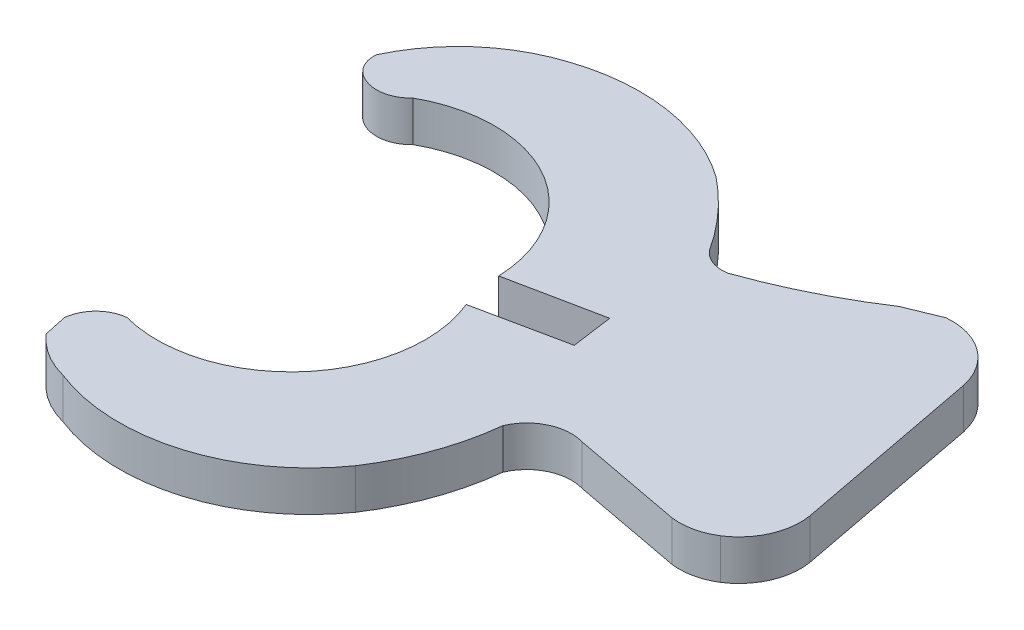
ISO-10303-21;
HEADER;
FILE_DESCRIPTION(('STEP AP214'),'2;1');
FILE_NAME('part.step','',(''),(''),'','','');
FILE_SCHEMA(('AUTOMOTIVE_DESIGN { 1 0 10303 214 1 1 1 1 }'));
ENDSEC;
DATA;
#1=APPLICATION_CONTEXT('core data for automotive mechanical design processes');
#2=APPLICATION_PROTOCOL_DEFINITION('international standard','automotive_design',2000,#1);
#3=PRODUCT_CONTEXT('',#1,'mechanical');
#4=PRODUCT('Part','Part','',(#3));
#5=PRODUCT_RELATED_PRODUCT_CATEGORY('part','',(#4));
#6=PRODUCT_DEFINITION_FORMATION('','',#4);
#7=PRODUCT_DEFINITION_CONTEXT('part definition',#1,'design');
#8=PRODUCT_DEFINITION('design','',#6,#7);
#9=PRODUCT_DEFINITION_SHAPE('','',#8);
#10=(LENGTH_UNIT() NAMED_UNIT(*) SI_UNIT(.MILLI.,.METRE.));
#11=(NAMED_UNIT(*) PLANE_ANGLE_UNIT() SI_UNIT($,.RADIAN.));
#12=(NAMED_UNIT(*) SI_UNIT($,.STERADIAN.) SOLID_ANGLE_UNIT());
#13=UNCERTAINTY_MEASURE_WITH_UNIT(LENGTH_MEASURE(1.E-05),#10,'distance_accuracy_value','');
#14=(GEOMETRIC_REPRESENTATION_CONTEXT(3) GLOBAL_UNCERTAINTY_ASSIGNED_CONTEXT((#13)) GLOBAL_UNIT_ASSIGNED_CONTEXT((#10,
#11,#12)) REPRESENTATION_CONTEXT('',''));
#15=CARTESIAN_POINT('',(0.,0.,0.));
#16=DIRECTION('',(0.,0.,1.));
#17=DIRECTION('',(1.,0.,0.));
#18=AXIS2_PLACEMENT_3D('',#15,#16,#17);
#19=CARTESIAN_POINT('',(-189.790209014968,3.,-54.2619894440154));
#20=DIRECTION('',(0.,-1.,0.));
#21=DIRECTION('',(0.,0.,-1.));
#22=AXIS2_PLACEMENT_3D('',#19,#20,#21);
#23=CYLINDRICAL_SURFACE('',#22,9.8473549206959);
#24=CARTESIAN_POINT('',(-189.790209014968,0.,-54.2619894440154));
#25=DIRECTION('',(0.,-1.,0.));
#26=DIRECTION('',(0.,0.,1.));
#27=AXIS2_PLACEMENT_3D('',#24,#25,#26);
#28=CIRCLE('',#27,9.8473549206959);
#29=CARTESIAN_POINT('',(-194.590600000006,0.,-62.8600500000321));
#30=VERTEX_POINT('',#29);
#31=CARTESIAN_POINT('',(-179.9485,0.,-54.5954));
#32=VERTEX_POINT('',#31);
#33=EDGE_CURVE('E227',#30,#32,#28,.T.);
#34=ORIENTED_EDGE('',*,*,#33,.T.);
#35=DIRECTION('',(0.,-1.,0.));
#36=VECTOR('',#35,1.);
#37=CARTESIAN_POINT('',(-179.9485,3.,-54.5954));
#38=LINE('',#37,#36);
#39=CARTESIAN_POINT('',(-179.9485,3.,-54.5954));
#40=VERTEX_POINT('',#39);
#41=EDGE_CURVE('E11',#40,#32,#38,.T.);
#42=ORIENTED_EDGE('',*,*,#41,.F.);
#43=CARTESIAN_POINT('',(-189.790209014968,3.,-54.2619894440154));
#44=DIRECTION('',(0.,-1.,0.));
#45=DIRECTION('',(0.,0.,1.));
#46=AXIS2_PLACEMENT_3D('',#43,#44,#45);
#47=CIRCLE('',#46,9.8473549206959);
#48=CARTESIAN_POINT('',(-194.590600000006,3.,-62.8600500000321));
#49=VERTEX_POINT('',#48);
#50=EDGE_CURVE('E273',#49,#40,#47,.T.);
#51=ORIENTED_EDGE('',*,*,#50,.F.);
#52=DIRECTION('',(0.,-1.,0.));
#53=VECTOR('',#52,1.);
#54=CARTESIAN_POINT('',(-194.590600000006,3.,-62.8600500000321));
#55=LINE('',#54,#53);
#56=EDGE_CURVE('E223',#49,#30,#55,.T.);
#57=ORIENTED_EDGE('',*,*,#56,.T.);
#58=EDGE_LOOP('',(#34,#42,#51,#57));
#59=FACE_BOUND('',#58,.T.);
#60=ADVANCED_FACE('F35',(#59),#23,.F.);
#61=CARTESIAN_POINT('',(-179.9485,3.,-54.5954));
#62=DIRECTION('',(-0.199884569018164,0.,-0.979819452281094));
#63=DIRECTION('',(-0.979819452281094,0.,0.199884569018164));
#64=AXIS2_PLACEMENT_3D('',#61,#62,#63);
#65=PLANE('',#64);
#66=DIRECTION('',(0.979819452281094,0.,-0.199884569018164));
#67=VECTOR('',#66,1.);
#68=CARTESIAN_POINT('',(-179.9485,0.,-54.5954));
#69=LINE('',#68,#67);
#70=CARTESIAN_POINT('',(-173.09345,0.,-55.99384));
#71=VERTEX_POINT('',#70);
#72=EDGE_CURVE('E230',#32,#71,#69,.T.);
#73=ORIENTED_EDGE('',*,*,#72,.T.);
#74=DIRECTION('',(0.,-1.,0.));
#75=VECTOR('',#74,1.);
#76=CARTESIAN_POINT('',(-173.09345,3.,-55.99384));
#77=LINE('',#76,#75);
#78=CARTESIAN_POINT('',(-173.09345,3.,-55.99384));
#79=VERTEX_POINT('',#78);
#80=EDGE_CURVE('E43',#79,#71,#77,.T.);
#81=ORIENTED_EDGE('',*,*,#80,.F.);
#82=DIRECTION('',(0.979819452281094,0.,-0.199884569018164));
#83=VECTOR('',#82,1.);
#84=CARTESIAN_POINT('',(-179.9485,3.,-54.5954));
#85=LINE('',#84,#83);
#86=EDGE_CURVE('E142',#40,#79,#85,.T.);
#87=ORIENTED_EDGE('',*,*,#86,.F.);
#88=ORIENTED_EDGE('',*,*,#41,.T.);
#89=EDGE_LOOP('',(#73,#81,#87,#88));
#90=FACE_BOUND('',#89,.T.);
#91=ADVANCED_FACE('F411',(#90),#65,.F.);
#92=CARTESIAN_POINT('',(-173.09345,3.,-55.99384));
#93=DIRECTION('',(0.990626040398804,0.,-0.136601786532197));
#94=DIRECTION('',(-0.136601786532197,0.,-0.990626040398804));
#95=AXIS2_PLACEMENT_3D('',#92,#93,#94);
#96=PLANE('',#95);
#97=DIRECTION('',(0.136601786532197,0.,0.990626040398804));
#98=VECTOR('',#97,1.);
#99=CARTESIAN_POINT('',(-173.09345,0.,-55.99384));
#100=LINE('',#99,#98);
#101=CARTESIAN_POINT('',(-172.67158,0.,-52.93447));
#102=VERTEX_POINT('',#101);
#103=EDGE_CURVE('E232',#71,#102,#100,.T.);
#104=ORIENTED_EDGE('',*,*,#103,.T.);
#105=DIRECTION('',(0.,-1.,0.));
#106=VECTOR('',#105,1.);
#107=CARTESIAN_POINT('',(-172.67158,3.,-52.93447));
#108=LINE('',#107,#106);
#109=CARTESIAN_POINT('',(-172.67158,3.,-52.93447));
#110=VERTEX_POINT('',#109);
#111=EDGE_CURVE('E328',#110,#102,#108,.T.);
#112=ORIENTED_EDGE('',*,*,#111,.F.);
#113=DIRECTION('',(0.136601786532197,0.,0.990626040398804));
#114=VECTOR('',#113,1.);
#115=CARTESIAN_POINT('',(-173.09345,3.,-55.99384));
#116=LINE('',#115,#114);
#117=EDGE_CURVE('E336',#79,#110,#116,.T.);
#118=ORIENTED_EDGE('',*,*,#117,.F.);
#119=ORIENTED_EDGE('',*,*,#80,.T.);
#120=EDGE_LOOP('',(#104,#112,#118,#119));
#121=FACE_BOUND('',#120,.T.);
#122=ADVANCED_FACE('F334',(#121),#96,.F.);
#123=CARTESIAN_POINT('',(-172.67158,3.,-52.93447));
#124=DIRECTION('',(0.204367247084627,0.,0.97889428863338));
#125=DIRECTION('',(0.97889428863338,0.,-0.204367247084627));
#126=AXIS2_PLACEMENT_3D('',#123,#124,#125);
#127=PLANE('',#126);
#128=DIRECTION('',(-0.97889428863338,0.,0.204367247084627));
#129=VECTOR('',#128,1.);
#130=CARTESIAN_POINT('',(-172.67158,0.,-52.93447));
#131=LINE('',#130,#129);
#132=CARTESIAN_POINT('',(-179.315859999997,0.,-51.5473200000194));
#133=VERTEX_POINT('',#132);
#134=EDGE_CURVE('E234',#102,#133,#131,.T.);
#135=ORIENTED_EDGE('',*,*,#134,.T.);
#136=DIRECTION('',(0.,-1.,0.));
#137=VECTOR('',#136,1.);
#138=CARTESIAN_POINT('',(-179.315859999997,3.,-51.5473200000194));
#139=LINE('',#138,#137);
#140=CARTESIAN_POINT('',(-179.315859999997,3.,-51.5473200000194));
#141=VERTEX_POINT('',#140);
#142=EDGE_CURVE('E325',#141,#133,#139,.T.);
#143=ORIENTED_EDGE('',*,*,#142,.F.);
#144=DIRECTION('',(-0.97889428863338,0.,0.204367247084627));
#145=VECTOR('',#144,1.);
#146=CARTESIAN_POINT('',(-172.67158,3.,-52.93447));
#147=LINE('',#146,#145);
#148=EDGE_CURVE('E354',#110,#141,#147,.T.);
#149=ORIENTED_EDGE('',*,*,#148,.F.);
#150=ORIENTED_EDGE('',*,*,#111,.T.);
#151=EDGE_LOOP('',(#135,#143,#149,#150));
#152=FACE_BOUND('',#151,.T.);
#153=ADVANCED_FACE('F345',(#152),#127,.F.);
#154=CARTESIAN_POINT('',(-188.5452592183,3.,-47.7496608923));
#155=DIRECTION('',(0.,-1.,0.));
#156=DIRECTION('',(0.,0.,-1.));
#157=AXIS2_PLACEMENT_3D('',#154,#155,#156);
#158=CYLINDRICAL_SURFACE('',#157,9.980181593);
#159=CARTESIAN_POINT('',(-188.5452592183,0.,-47.7496608923));
#160=DIRECTION('',(0.,-1.,0.));
#161=DIRECTION('',(0.,0.,1.));
#162=AXIS2_PLACEMENT_3D('',#159,#160,#161);
#163=CIRCLE('',#162,9.980181593);
#164=CARTESIAN_POINT('',(-191.096100000033,0.,-38.1009699999819));
#165=VERTEX_POINT('',#164);
#166=EDGE_CURVE('E236',#133,#165,#163,.T.);
#167=ORIENTED_EDGE('',*,*,#166,.T.);
#168=DIRECTION('',(0.,-1.,0.));
#169=VECTOR('',#168,1.);
#170=CARTESIAN_POINT('',(-191.096100000033,3.,-38.1009699999819));
#171=LINE('',#170,#169);
#172=CARTESIAN_POINT('',(-191.096100000033,3.,-38.1009699999819));
#173=VERTEX_POINT('',#172);
#174=EDGE_CURVE('E322',#173,#165,#171,.T.);
#175=ORIENTED_EDGE('',*,*,#174,.F.);
#176=CARTESIAN_POINT('',(-188.5452592183,3.,-47.7496608923));
#177=DIRECTION('',(0.,-1.,0.));
#178=DIRECTION('',(0.,0.,1.));
#179=AXIS2_PLACEMENT_3D('',#176,#177,#178);
#180=CIRCLE('',#179,9.980181593);
#181=EDGE_CURVE('E351',#141,#173,#180,.T.);
#182=ORIENTED_EDGE('',*,*,#181,.F.);
#183=ORIENTED_EDGE('',*,*,#142,.T.);
#184=EDGE_LOOP('',(#167,#175,#182,#183));
#185=FACE_BOUND('',#184,.T.);
#186=ADVANCED_FACE('F349',(#185),#158,.F.);
#187=CARTESIAN_POINT('',(-190.807242270197,3.,-35.501727707026));
#188=DIRECTION('',(0.,-1.,0.));
#189=DIRECTION('',(0.,0.,-1.));
#190=AXIS2_PLACEMENT_3D('',#187,#188,#189);
#191=CYLINDRICAL_SURFACE('',#190,2.6152436379);
#192=CARTESIAN_POINT('',(-190.807242270197,0.,-35.501727707026));
#193=DIRECTION('',(0.,1.,0.));
#194=DIRECTION('',(0.,0.,1.));
#195=AXIS2_PLACEMENT_3D('',#192,#193,#194);
#196=CIRCLE('',#195,2.6152436379);
#197=CARTESIAN_POINT('',(-193.409239999947,0.,-35.7646099999899));
#198=VERTEX_POINT('',#197);
#199=EDGE_CURVE('E238',#165,#198,#196,.T.);
#200=ORIENTED_EDGE('',*,*,#199,.T.);
#201=DIRECTION('',(0.,-1.,0.));
#202=VECTOR('',#201,1.);
#203=CARTESIAN_POINT('',(-193.409239999947,3.,-35.7646099999899));
#204=LINE('',#203,#202);
#205=CARTESIAN_POINT('',(-193.409239999947,3.,-35.7646099999899));
#206=VERTEX_POINT('',#205);
#207=EDGE_CURVE('E319',#206,#198,#204,.T.);
#208=ORIENTED_EDGE('',*,*,#207,.F.);
#209=CARTESIAN_POINT('',(-190.807242270197,3.,-35.501727707026));
#210=DIRECTION('',(0.,1.,0.));
#211=DIRECTION('',(0.,0.,1.));
#212=AXIS2_PLACEMENT_3D('',#209,#210,#211);
#213=CIRCLE('',#212,2.6152436379);
#214=EDGE_CURVE('E353',#173,#206,#213,.T.);
#215=ORIENTED_EDGE('',*,*,#214,.F.);
#216=ORIENTED_EDGE('',*,*,#174,.T.);
#217=EDGE_LOOP('',(#200,#208,#215,#216));
#218=FACE_BOUND('',#217,.T.);
#219=ADVANCED_FACE('F424',(#218),#191,.T.);
#220=CARTESIAN_POINT('',(-193.409239999947,3.,-35.7646099999899));
#221=DIRECTION('',(0.977702522578803,0.,-0.209994707892948));
#222=DIRECTION('',(-0.209994707892948,0.,-0.977702522578803));
#223=AXIS2_PLACEMENT_3D('',#220,#221,#222);
#224=PLANE('',#223);
#225=DIRECTION('',(0.209994707892948,0.,0.977702522578803));
#226=VECTOR('',#225,1.);
#227=CARTESIAN_POINT('',(-193.409239999947,0.,-35.7646099999899));
#228=LINE('',#227,#226);
#229=CARTESIAN_POINT('',(-193.04089,0.,-34.04963));
#230=VERTEX_POINT('',#229);
#231=EDGE_CURVE('E240',#198,#230,#228,.T.);
#232=ORIENTED_EDGE('',*,*,#231,.T.);
#233=DIRECTION('',(0.,-1.,0.));
#234=VECTOR('',#233,1.);
#235=CARTESIAN_POINT('',(-193.04089,3.,-34.04963));
#236=LINE('',#235,#234);
#237=CARTESIAN_POINT('',(-193.04089,3.,-34.04963));
#238=VERTEX_POINT('',#237);
#239=EDGE_CURVE('E316',#238,#230,#236,.T.);
#240=ORIENTED_EDGE('',*,*,#239,.F.);
#241=DIRECTION('',(0.209994707892948,0.,0.977702522578803));
#242=VECTOR('',#241,1.);
#243=CARTESIAN_POINT('',(-193.409239999947,3.,-35.7646099999899));
#244=LINE('',#243,#242);
#245=EDGE_CURVE('E356',#206,#238,#244,.T.);
#246=ORIENTED_EDGE('',*,*,#245,.F.);
#247=ORIENTED_EDGE('',*,*,#207,.T.);
#248=EDGE_LOOP('',(#232,#240,#246,#247));
#249=FACE_BOUND('',#248,.T.);
#250=ADVANCED_FACE('F427',(#249),#224,.F.);
#251=CARTESIAN_POINT('',(-188.179972638056,3.,-38.2084554085401));
#252=DIRECTION('',(0.,-1.,0.));
#253=DIRECTION('',(0.,0.,-1.));
#254=AXIS2_PLACEMENT_3D('',#251,#252,#253);
#255=CYLINDRICAL_SURFACE('',#254,6.3972139544);
#256=CARTESIAN_POINT('',(-188.179972638056,0.,-38.2084554085401));
#257=DIRECTION('',(0.,1.,0.));
#258=DIRECTION('',(0.,0.,1.));
#259=AXIS2_PLACEMENT_3D('',#256,#257,#258);
#260=CIRCLE('',#259,6.3972139544);
#261=CARTESIAN_POINT('',(-189.776369999954,0.,-32.0136300000808));
#262=VERTEX_POINT('',#261);
#263=EDGE_CURVE('E242',#230,#262,#260,.T.);
#264=ORIENTED_EDGE('',*,*,#263,.T.);
#265=DIRECTION('',(0.,-1.,0.));
#266=VECTOR('',#265,1.);
#267=CARTESIAN_POINT('',(-189.776369999954,3.,-32.0136300000808));
#268=LINE('',#267,#266);
#269=CARTESIAN_POINT('',(-189.776369999954,3.,-32.0136300000808));
#270=VERTEX_POINT('',#269);
#271=EDGE_CURVE('E313',#270,#262,#268,.T.);
#272=ORIENTED_EDGE('',*,*,#271,.F.);
#273=CARTESIAN_POINT('',(-188.179972638056,3.,-38.2084554085401));
#274=DIRECTION('',(0.,1.,0.));
#275=DIRECTION('',(0.,0.,1.));
#276=AXIS2_PLACEMENT_3D('',#273,#274,#275);
#277=CIRCLE('',#276,6.3972139544);
#278=EDGE_CURVE('E362',#238,#270,#277,.T.);
#279=ORIENTED_EDGE('',*,*,#278,.F.);
#280=ORIENTED_EDGE('',*,*,#239,.T.);
#281=EDGE_LOOP('',(#264,#272,#279,#280));
#282=FACE_BOUND('',#281,.T.);
#283=ADVANCED_FACE('F431',(#282),#255,.T.);
#284=CARTESIAN_POINT('',(-184.627202129404,3.,-45.2015593580367));
#285=DIRECTION('',(0.,-1.,0.));
#286=DIRECTION('',(0.,0.,-1.));
#287=AXIS2_PLACEMENT_3D('',#284,#285,#286);
#288=CYLINDRICAL_SURFACE('',#287,14.1575213406);
#289=CARTESIAN_POINT('',(-184.627202129404,0.,-45.2015593580367));
#290=DIRECTION('',(0.,1.,0.));
#291=DIRECTION('',(0.,0.,1.));
#292=AXIS2_PLACEMENT_3D('',#289,#290,#291);
#293=CIRCLE('',#292,14.1575213406);
#294=CARTESIAN_POINT('',(-173.046290000033,0.,-37.057979999957));
#295=VERTEX_POINT('',#294);
#296=EDGE_CURVE('E244',#262,#295,#293,.T.);
#297=ORIENTED_EDGE('',*,*,#296,.T.);
#298=DIRECTION('',(0.,-1.,0.));
#299=VECTOR('',#298,1.);
#300=CARTESIAN_POINT('',(-173.046290000033,3.,-37.057979999957));
#301=LINE('',#300,#299);
#302=CARTESIAN_POINT('',(-173.046290000033,3.,-37.057979999957));
#303=VERTEX_POINT('',#302);
#304=EDGE_CURVE('E310',#303,#295,#301,.T.);
#305=ORIENTED_EDGE('',*,*,#304,.F.);
#306=CARTESIAN_POINT('',(-184.627202129404,3.,-45.2015593580367));
#307=DIRECTION('',(0.,1.,0.));
#308=DIRECTION('',(0.,0.,1.));
#309=AXIS2_PLACEMENT_3D('',#306,#307,#308);
#310=CIRCLE('',#309,14.1575213406);
#311=EDGE_CURVE('E364',#270,#303,#310,.T.);
#312=ORIENTED_EDGE('',*,*,#311,.F.);
#313=ORIENTED_EDGE('',*,*,#271,.T.);
#314=EDGE_LOOP('',(#297,#305,#312,#313));
#315=FACE_BOUND('',#314,.T.);
#316=ADVANCED_FACE('F435',(#315),#288,.T.);
#317=CARTESIAN_POINT('',(-188.321957897398,3.,-47.0926958520139));
#318=DIRECTION('',(0.,-1.,0.));
#319=DIRECTION('',(0.,0.,-1.));
#320=AXIS2_PLACEMENT_3D('',#317,#318,#319);
#321=CYLINDRICAL_SURFACE('',#320,18.2768036577);
#322=CARTESIAN_POINT('',(-188.321957897398,0.,-47.0926958520139));
#323=DIRECTION('',(0.,1.,0.));
#324=DIRECTION('',(0.,0.,1.));
#325=AXIS2_PLACEMENT_3D('',#322,#323,#324);
#326=CIRCLE('',#325,18.2768036577);
#327=CARTESIAN_POINT('',(-170.152950000006,0.,-45.1105999999925));
#328=VERTEX_POINT('',#327);
#329=EDGE_CURVE('E246',#295,#328,#326,.T.);
#330=ORIENTED_EDGE('',*,*,#329,.T.);
#331=DIRECTION('',(0.,-1.,0.));
#332=VECTOR('',#331,1.);
#333=CARTESIAN_POINT('',(-170.152950000006,3.,-45.1105999999925));
#334=LINE('',#333,#332);
#335=CARTESIAN_POINT('',(-170.152950000006,3.,-45.1105999999925));
#336=VERTEX_POINT('',#335);
#337=EDGE_CURVE('E307',#336,#328,#334,.T.);
#338=ORIENTED_EDGE('',*,*,#337,.F.);
#339=CARTESIAN_POINT('',(-188.321957897398,3.,-47.0926958520139));
#340=DIRECTION('',(0.,1.,0.));
#341=DIRECTION('',(0.,0.,1.));
#342=AXIS2_PLACEMENT_3D('',#339,#340,#341);
#343=CIRCLE('',#342,18.2768036577);
#344=EDGE_CURVE('E366',#303,#336,#343,.T.);
#345=ORIENTED_EDGE('',*,*,#344,.F.);
#346=ORIENTED_EDGE('',*,*,#304,.T.);
#347=EDGE_LOOP('',(#330,#338,#345,#346));
#348=FACE_BOUND('',#347,.T.);
#349=ADVANCED_FACE('F439',(#348),#321,.T.);
#350=CARTESIAN_POINT('',(-167.090596226603,3.,-43.8205217894015));
#351=DIRECTION('',(0.,-1.,0.));
#352=DIRECTION('',(0.,0.,-1.));
#353=AXIS2_PLACEMENT_3D('',#350,#351,#352);
#354=CYLINDRICAL_SURFACE('',#353,3.32299750570377);
#355=CARTESIAN_POINT('',(-167.090596226603,0.,-43.8205217894015));
#356=DIRECTION('',(0.,-1.,0.));
#357=DIRECTION('',(0.,0.,1.));
#358=AXIS2_PLACEMENT_3D('',#355,#356,#357);
#359=CIRCLE('',#358,3.32299750570377);
#360=CARTESIAN_POINT('',(-166.151630000051,0.,-47.0080999999411));
#361=VERTEX_POINT('',#360);
#362=EDGE_CURVE('E248',#328,#361,#359,.T.);
#363=ORIENTED_EDGE('',*,*,#362,.T.);
#364=DIRECTION('',(0.,-1.,0.));
#365=VECTOR('',#364,1.);
#366=CARTESIAN_POINT('',(-166.151630000051,3.,-47.0080999999411));
#367=LINE('',#366,#365);
#368=CARTESIAN_POINT('',(-166.151630000051,3.,-47.0080999999411));
#369=VERTEX_POINT('',#368);
#370=EDGE_CURVE('E304',#369,#361,#367,.T.);
#371=ORIENTED_EDGE('',*,*,#370,.F.);
#372=CARTESIAN_POINT('',(-167.090596226603,3.,-43.8205217894015));
#373=DIRECTION('',(0.,-1.,0.));
#374=DIRECTION('',(0.,0.,1.));
#375=AXIS2_PLACEMENT_3D('',#372,#373,#374);
#376=CIRCLE('',#375,3.32299750570377);
#377=EDGE_CURVE('E368',#336,#369,#376,.T.);
#378=ORIENTED_EDGE('',*,*,#377,.F.);
#379=ORIENTED_EDGE('',*,*,#337,.T.);
#380=EDGE_LOOP('',(#363,#371,#378,#379));
#381=FACE_BOUND('',#380,.T.);
#382=ADVANCED_FACE('F443',(#381),#354,.F.);
#383=CARTESIAN_POINT('',(-166.151630000051,3.,-47.0080999999411));
#384=DIRECTION('',(0.184882141518905,0.,-0.982760700143928));
#385=DIRECTION('',(-0.982760700143928,0.,-0.184882141518905));
#386=AXIS2_PLACEMENT_3D('',#383,#384,#385);
#387=PLANE('',#386);
#388=DIRECTION('',(0.982760700143928,0.,0.184882141518905));
#389=VECTOR('',#388,1.);
#390=CARTESIAN_POINT('',(-166.151630000051,0.,-47.0080999999411));
#391=LINE('',#390,#389);
#392=CARTESIAN_POINT('',(-157.913450000002,0.,-45.4582900000051));
#393=VERTEX_POINT('',#392);
#394=EDGE_CURVE('E250',#361,#393,#391,.T.);
#395=ORIENTED_EDGE('',*,*,#394,.T.);
#396=DIRECTION('',(0.,-1.,0.));
#397=VECTOR('',#396,1.);
#398=CARTESIAN_POINT('',(-157.913450000002,3.,-45.4582900000051));
#399=LINE('',#398,#397);
#400=CARTESIAN_POINT('',(-157.913450000002,3.,-45.4582900000051));
#401=VERTEX_POINT('',#400);
#402=EDGE_CURVE('E301',#401,#393,#399,.T.);
#403=ORIENTED_EDGE('',*,*,#402,.F.);
#404=DIRECTION('',(0.982760700143928,0.,0.184882141518905));
#405=VECTOR('',#404,1.);
#406=CARTESIAN_POINT('',(-166.151630000051,3.,-47.0080999999411));
#407=LINE('',#406,#405);
#408=EDGE_CURVE('E370',#369,#401,#407,.T.);
#409=ORIENTED_EDGE('',*,*,#408,.F.);
#410=ORIENTED_EDGE('',*,*,#370,.T.);
#411=EDGE_LOOP('',(#395,#403,#409,#410));
#412=FACE_BOUND('',#411,.T.);
#413=ADVANCED_FACE('F447',(#412),#387,.F.);
#414=CARTESIAN_POINT('',(-157.3529120116,3.,-49.9099273524679));
#415=DIRECTION('',(0.,-1.,0.));
#416=DIRECTION('',(0.,0.,-1.));
#417=AXIS2_PLACEMENT_3D('',#414,#415,#416);
#418=CYLINDRICAL_SURFACE('',#417,4.4867892701);
#419=CARTESIAN_POINT('',(-157.3529120116,0.,-49.9099273524679));
#420=DIRECTION('',(0.,1.,0.));
#421=DIRECTION('',(0.,0.,1.));
#422=AXIS2_PLACEMENT_3D('',#419,#420,#421);
#423=CIRCLE('',#422,4.4867892701);
#424=CARTESIAN_POINT('',(-154.972820000001,0.,-46.1064500000169));
#425=VERTEX_POINT('',#424);
#426=EDGE_CURVE('E252',#393,#425,#423,.T.);
#427=ORIENTED_EDGE('',*,*,#426,.T.);
#428=DIRECTION('',(0.,-1.,0.));
#429=VECTOR('',#428,1.);
#430=CARTESIAN_POINT('',(-154.972820000001,3.,-46.1064500000169));
#431=LINE('',#430,#429);
#432=CARTESIAN_POINT('',(-154.972820000001,3.,-46.1064500000169));
#433=VERTEX_POINT('',#432);
#434=EDGE_CURVE('E298',#433,#425,#431,.T.);
#435=ORIENTED_EDGE('',*,*,#434,.F.);
#436=CARTESIAN_POINT('',(-157.3529120116,3.,-49.9099273524679));
#437=DIRECTION('',(0.,1.,0.));
#438=DIRECTION('',(0.,0.,1.));
#439=AXIS2_PLACEMENT_3D('',#436,#437,#438);
#440=CIRCLE('',#439,4.4867892701);
#441=EDGE_CURVE('E372',#401,#433,#440,.T.);
#442=ORIENTED_EDGE('',*,*,#441,.F.);
#443=ORIENTED_EDGE('',*,*,#402,.T.);
#444=EDGE_LOOP('',(#427,#435,#442,#443));
#445=FACE_BOUND('',#444,.T.);
#446=ADVANCED_FACE('F451',(#445),#418,.T.);
#447=CARTESIAN_POINT('',(-157.441867084991,3.,-49.9545466279123));
#448=DIRECTION('',(0.,-1.,0.));
#449=DIRECTION('',(0.,0.,-1.));
#450=AXIS2_PLACEMENT_3D('',#447,#448,#449);
#451=CYLINDRICAL_SURFACE('',#450,4.5720937398);
#452=CARTESIAN_POINT('',(-157.441867084991,0.,-49.9545466279123));
#453=DIRECTION('',(0.,1.,0.));
#454=DIRECTION('',(0.,0.,1.));
#455=AXIS2_PLACEMENT_3D('',#452,#453,#454);
#456=CIRCLE('',#455,4.5720937398);
#457=CARTESIAN_POINT('',(-152.936950000031,0.,-50.7354199999462));
#458=VERTEX_POINT('',#457);
#459=EDGE_CURVE('E254',#425,#458,#456,.T.);
#460=ORIENTED_EDGE('',*,*,#459,.T.);
#461=DIRECTION('',(0.,-1.,0.));
#462=VECTOR('',#461,1.);
#463=CARTESIAN_POINT('',(-152.936950000031,3.,-50.7354199999462));
#464=LINE('',#463,#462);
#465=CARTESIAN_POINT('',(-152.936950000031,3.,-50.7354199999462));
#466=VERTEX_POINT('',#465);
#467=EDGE_CURVE('E295',#466,#458,#464,.T.);
#468=ORIENTED_EDGE('',*,*,#467,.F.);
#469=CARTESIAN_POINT('',(-157.441867084991,3.,-49.9545466279123));
#470=DIRECTION('',(0.,1.,0.));
#471=DIRECTION('',(0.,0.,1.));
#472=AXIS2_PLACEMENT_3D('',#469,#470,#471);
#473=CIRCLE('',#472,4.5720937398);
#474=EDGE_CURVE('E374',#433,#466,#473,.T.);
#475=ORIENTED_EDGE('',*,*,#474,.F.);
#476=ORIENTED_EDGE('',*,*,#434,.T.);
#477=EDGE_LOOP('',(#460,#468,#475,#476));
#478=FACE_BOUND('',#477,.T.);
#479=ADVANCED_FACE('F455',(#478),#451,.T.);
#480=CARTESIAN_POINT('',(-152.936950000031,3.,-50.7354199999462));
#481=DIRECTION('',(-0.982341403296808,0.,0.187097213685446));
#482=DIRECTION('',(0.187097213685446,0.,0.982341403296808));
#483=AXIS2_PLACEMENT_3D('',#480,#481,#482);
#484=PLANE('',#483);
#485=DIRECTION('',(-0.187097213685446,0.,-0.982341403296808));
#486=VECTOR('',#485,1.);
#487=CARTESIAN_POINT('',(-152.936950000031,0.,-50.7354199999462));
#488=LINE('',#487,#486);
#489=CARTESIAN_POINT('',(-155.621099999985,0.,-64.8283699999772));
#490=VERTEX_POINT('',#489);
#491=EDGE_CURVE('E256',#458,#490,#488,.T.);
#492=ORIENTED_EDGE('',*,*,#491,.T.);
#493=DIRECTION('',(0.,-1.,0.));
#494=VECTOR('',#493,1.);
#495=CARTESIAN_POINT('',(-155.621099999985,3.,-64.8283699999772));
#496=LINE('',#495,#494);
#497=CARTESIAN_POINT('',(-155.621099999985,3.,-64.8283699999772));
#498=VERTEX_POINT('',#497);
#499=EDGE_CURVE('E292',#498,#490,#496,.T.);
#500=ORIENTED_EDGE('',*,*,#499,.F.);
#501=DIRECTION('',(-0.187097213685446,0.,-0.982341403296808));
#502=VECTOR('',#501,1.);
#503=CARTESIAN_POINT('',(-152.936950000031,3.,-50.7354199999462));
#504=LINE('',#503,#502);
#505=EDGE_CURVE('E376',#466,#498,#504,.T.);
#506=ORIENTED_EDGE('',*,*,#505,.F.);
#507=ORIENTED_EDGE('',*,*,#467,.T.);
#508=EDGE_LOOP('',(#492,#500,#506,#507));
#509=FACE_BOUND('',#508,.T.);
#510=ADVANCED_FACE('F459',(#509),#484,.F.);
#511=CARTESIAN_POINT('',(-160.203636849932,3.,-63.8648276685819));
#512=DIRECTION('',(0.,-1.,0.));
#513=DIRECTION('',(0.,0.,-1.));
#514=AXIS2_PLACEMENT_3D('',#511,#512,#513);
#515=CYLINDRICAL_SURFACE('',#514,4.68274041620001);
#516=CARTESIAN_POINT('',(-160.203636849932,0.,-63.8648276685819));
#517=DIRECTION('',(0.,1.,0.));
#518=DIRECTION('',(0.,0.,1.));
#519=AXIS2_PLACEMENT_3D('',#516,#517,#518);
#520=CIRCLE('',#519,4.68274041620001);
#521=CARTESIAN_POINT('',(-160.621130000006,0.,-68.5289199999101));
#522=VERTEX_POINT('',#521);
#523=EDGE_CURVE('E258',#490,#522,#520,.T.);
#524=ORIENTED_EDGE('',*,*,#523,.T.);
#525=DIRECTION('',(0.,-1.,0.));
#526=VECTOR('',#525,1.);
#527=CARTESIAN_POINT('',(-160.621130000006,3.,-68.5289199999101));
#528=LINE('',#527,#526);
#529=CARTESIAN_POINT('',(-160.621130000006,3.,-68.5289199999101));
#530=VERTEX_POINT('',#529);
#531=EDGE_CURVE('E289',#530,#522,#528,.T.);
#532=ORIENTED_EDGE('',*,*,#531,.F.);
#533=CARTESIAN_POINT('',(-160.203636849932,3.,-63.8648276685819));
#534=DIRECTION('',(0.,1.,0.));
#535=DIRECTION('',(0.,0.,1.));
#536=AXIS2_PLACEMENT_3D('',#533,#534,#535);
#537=CIRCLE('',#536,4.68274041620001);
#538=EDGE_CURVE('E378',#498,#530,#537,.T.);
#539=ORIENTED_EDGE('',*,*,#538,.F.);
#540=ORIENTED_EDGE('',*,*,#499,.T.);
#541=EDGE_LOOP('',(#524,#532,#539,#540));
#542=FACE_BOUND('',#541,.T.);
#543=ADVANCED_FACE('F463',(#542),#515,.T.);
#544=CARTESIAN_POINT('',(-160.621130000006,3.,-68.5289199999101));
#545=DIRECTION('',(0.379913143229413,0.,0.925022163843412));
#546=DIRECTION('',(0.925022163843412,0.,-0.379913143229413));
#547=AXIS2_PLACEMENT_3D('',#544,#545,#546);
#548=PLANE('',#547);
#549=DIRECTION('',(-0.925022163843412,0.,0.379913143229413));
#550=VECTOR('',#549,1.);
#551=CARTESIAN_POINT('',(-160.621130000006,0.,-68.5289199999101));
#552=LINE('',#551,#550);
#553=CARTESIAN_POINT('',(-163.096129999985,0.,-67.5124199999772));
#554=VERTEX_POINT('',#553);
#555=EDGE_CURVE('E260',#522,#554,#552,.T.);
#556=ORIENTED_EDGE('',*,*,#555,.T.);
#557=DIRECTION('',(0.,-1.,0.));
#558=VECTOR('',#557,1.);
#559=CARTESIAN_POINT('',(-163.096129999985,3.,-67.5124199999772));
#560=LINE('',#559,#558);
#561=CARTESIAN_POINT('',(-163.096129999985,3.,-67.5124199999772));
#562=VERTEX_POINT('',#561);
#563=EDGE_CURVE('E286',#562,#554,#560,.T.);
#564=ORIENTED_EDGE('',*,*,#563,.F.);
#565=DIRECTION('',(-0.925022163843412,0.,0.379913143229413));
#566=VECTOR('',#565,1.);
#567=CARTESIAN_POINT('',(-160.621130000006,3.,-68.5289199999101));
#568=LINE('',#567,#566);
#569=EDGE_CURVE('E380',#530,#562,#568,.T.);
#570=ORIENTED_EDGE('',*,*,#569,.F.);
#571=ORIENTED_EDGE('',*,*,#531,.T.);
#572=EDGE_LOOP('',(#556,#564,#570,#571));
#573=FACE_BOUND('',#572,.T.);
#574=ADVANCED_FACE('F467',(#573),#548,.F.);
#575=CARTESIAN_POINT('',(-184.753963729575,3.,-100.498293111233));
#576=DIRECTION('',(0.,-1.,0.));
#577=DIRECTION('',(0.,0.,-1.));
#578=AXIS2_PLACEMENT_3D('',#575,#576,#577);
#579=CYLINDRICAL_SURFACE('',#578,39.4604813296851);
#580=CARTESIAN_POINT('',(-184.753963729575,0.,-100.498293111233));
#581=DIRECTION('',(0.,-1.,0.));
#582=DIRECTION('',(0.,0.,1.));
#583=AXIS2_PLACEMENT_3D('',#580,#581,#582);
#584=CIRCLE('',#583,39.4604813296851);
#585=CARTESIAN_POINT('',(-171.58778999999,0.,-63.2990800000282));
#586=VERTEX_POINT('',#585);
#587=EDGE_CURVE('E262',#554,#586,#584,.T.);
#588=ORIENTED_EDGE('',*,*,#587,.T.);
#589=DIRECTION('',(0.,-1.,0.));
#590=VECTOR('',#589,1.);
#591=CARTESIAN_POINT('',(-171.58778999999,3.,-63.2990800000282));
#592=LINE('',#591,#590);
#593=CARTESIAN_POINT('',(-171.58778999999,3.,-63.2990800000282));
#594=VERTEX_POINT('',#593);
#595=EDGE_CURVE('E283',#594,#586,#592,.T.);
#596=ORIENTED_EDGE('',*,*,#595,.F.);
#597=CARTESIAN_POINT('',(-184.753963729575,3.,-100.498293111233));
#598=DIRECTION('',(0.,-1.,0.));
#599=DIRECTION('',(0.,0.,1.));
#600=AXIS2_PLACEMENT_3D('',#597,#598,#599);
#601=CIRCLE('',#600,39.4604813296851);
#602=EDGE_CURVE('E382',#562,#594,#601,.T.);
#603=ORIENTED_EDGE('',*,*,#602,.F.);
#604=ORIENTED_EDGE('',*,*,#563,.T.);
#605=EDGE_LOOP('',(#588,#596,#603,#604));
#606=FACE_BOUND('',#605,.T.);
#607=ADVANCED_FACE('F471',(#606),#579,.F.);
#608=CARTESIAN_POINT('',(-172.021425872898,3.,-65.5060085091037));
#609=DIRECTION('',(0.,-1.,0.));
#610=DIRECTION('',(0.,0.,-1.));
#611=AXIS2_PLACEMENT_3D('',#608,#609,#610);
#612=CYLINDRICAL_SURFACE('',#611,2.24912727839997);
#613=CARTESIAN_POINT('',(-172.021425872898,0.,-65.5060085091037));
#614=DIRECTION('',(0.,-1.,0.));
#615=DIRECTION('',(0.,0.,1.));
#616=AXIS2_PLACEMENT_3D('',#613,#614,#615);
#617=CIRCLE('',#616,2.24912727839997);
#618=CARTESIAN_POINT('',(-173.765389999983,0.,-64.0857400000245));
#619=VERTEX_POINT('',#618);
#620=EDGE_CURVE('E264',#586,#619,#617,.T.);
#621=ORIENTED_EDGE('',*,*,#620,.T.);
#622=DIRECTION('',(0.,-1.,0.));
#623=VECTOR('',#622,1.);
#624=CARTESIAN_POINT('',(-173.765389999983,3.,-64.0857400000245));
#625=LINE('',#624,#623);
#626=CARTESIAN_POINT('',(-173.765389999983,3.,-64.0857400000245));
#627=VERTEX_POINT('',#626);
#628=EDGE_CURVE('E280',#627,#619,#625,.T.);
#629=ORIENTED_EDGE('',*,*,#628,.F.);
#630=CARTESIAN_POINT('',(-172.021425872898,3.,-65.5060085091037));
#631=DIRECTION('',(0.,-1.,0.));
#632=DIRECTION('',(0.,0.,1.));
#633=AXIS2_PLACEMENT_3D('',#630,#631,#632);
#634=CIRCLE('',#633,2.24912727839997);
#635=EDGE_CURVE('E384',#594,#627,#634,.T.);
#636=ORIENTED_EDGE('',*,*,#635,.F.);
#637=ORIENTED_EDGE('',*,*,#595,.T.);
#638=EDGE_LOOP('',(#621,#629,#636,#637));
#639=FACE_BOUND('',#638,.T.);
#640=ADVANCED_FACE('F475',(#639),#612,.F.);
#641=CARTESIAN_POINT('',(-191.233098384992,3.,-52.8311171121988));
#642=DIRECTION('',(0.,-1.,0.));
#643=DIRECTION('',(0.,0.,-1.));
#644=AXIS2_PLACEMENT_3D('',#641,#642,#643);
#645=CYLINDRICAL_SURFACE('',#644,20.7794940403);
#646=CARTESIAN_POINT('',(-191.233098384992,0.,-52.8311171121988));
#647=DIRECTION('',(0.,1.,0.));
#648=DIRECTION('',(0.,0.,1.));
#649=AXIS2_PLACEMENT_3D('',#646,#647,#648);
#650=CIRCLE('',#649,20.7794940403);
#651=CARTESIAN_POINT('',(-178.229239999987,0.,-69.038740000013));
#652=VERTEX_POINT('',#651);
#653=EDGE_CURVE('E266',#619,#652,#650,.T.);
#654=ORIENTED_EDGE('',*,*,#653,.T.);
#655=DIRECTION('',(0.,-1.,0.));
#656=VECTOR('',#655,1.);
#657=CARTESIAN_POINT('',(-178.229239999987,3.,-69.038740000013));
#658=LINE('',#657,#656);
#659=CARTESIAN_POINT('',(-178.229239999987,3.,-69.038740000013));
#660=VERTEX_POINT('',#659);
#661=EDGE_CURVE('E277',#660,#652,#658,.T.);
#662=ORIENTED_EDGE('',*,*,#661,.F.);
#663=CARTESIAN_POINT('',(-191.233098384992,3.,-52.8311171121988));
#664=DIRECTION('',(0.,1.,0.));
#665=DIRECTION('',(0.,0.,1.));
#666=AXIS2_PLACEMENT_3D('',#663,#664,#665);
#667=CIRCLE('',#666,20.7794940403);
#668=EDGE_CURVE('E386',#627,#660,#667,.T.);
#669=ORIENTED_EDGE('',*,*,#668,.F.);
#670=ORIENTED_EDGE('',*,*,#628,.T.);
#671=EDGE_LOOP('',(#654,#662,#669,#670));
#672=FACE_BOUND('',#671,.T.);
#673=ADVANCED_FACE('F392',(#672),#645,.T.);
#674=CARTESIAN_POINT('',(-186.564287492044,3.,-57.4290011323217));
#675=DIRECTION('',(0.,-1.,0.));
#676=DIRECTION('',(0.,0.,-1.));
#677=AXIS2_PLACEMENT_3D('',#674,#675,#676);
#678=CYLINDRICAL_SURFACE('',#677,14.2919226583);
#679=CARTESIAN_POINT('',(-186.564287492044,0.,-57.4290011323217));
#680=DIRECTION('',(0.,1.,0.));
#681=DIRECTION('',(0.,0.,1.));
#682=AXIS2_PLACEMENT_3D('',#679,#680,#681);
#683=CIRCLE('',#682,14.2919226583);
#684=CARTESIAN_POINT('',(-191.096100000025,0.,-70.9833999999711));
#685=VERTEX_POINT('',#684);
#686=EDGE_CURVE('E268',#652,#685,#683,.T.);
#687=ORIENTED_EDGE('',*,*,#686,.T.);
#688=DIRECTION('',(0.,-1.,0.));
#689=VECTOR('',#688,1.);
#690=CARTESIAN_POINT('',(-191.096100000025,3.,-70.9833999999711));
#691=LINE('',#690,#689);
#692=CARTESIAN_POINT('',(-191.096100000025,3.,-70.9833999999711));
#693=VERTEX_POINT('',#692);
#694=EDGE_CURVE('E218',#693,#685,#691,.T.);
#695=ORIENTED_EDGE('',*,*,#694,.F.);
#696=CARTESIAN_POINT('',(-186.564287492044,3.,-57.4290011323217));
#697=DIRECTION('',(0.,1.,0.));
#698=DIRECTION('',(0.,0.,1.));
#699=AXIS2_PLACEMENT_3D('',#696,#697,#698);
#700=CIRCLE('',#699,14.2919226583);
#701=EDGE_CURVE('E209',#660,#693,#700,.T.);
#702=ORIENTED_EDGE('',*,*,#701,.F.);
#703=ORIENTED_EDGE('',*,*,#661,.T.);
#704=EDGE_LOOP('',(#687,#695,#702,#703));
#705=FACE_BOUND('',#704,.T.);
#706=ADVANCED_FACE('F396',(#705),#678,.T.);
#707=CARTESIAN_POINT('',(-187.266242183064,3.,-58.9055480881754));
#708=DIRECTION('',(0.,-1.,0.));
#709=DIRECTION('',(0.,0.,-1.));
#710=AXIS2_PLACEMENT_3D('',#707,#708,#709);
#711=CYLINDRICAL_SURFACE('',#710,12.6705294957);
#712=CARTESIAN_POINT('',(-187.266242183064,0.,-58.9055480881754));
#713=DIRECTION('',(0.,1.,0.));
#714=DIRECTION('',(0.,0.,1.));
#715=AXIS2_PLACEMENT_3D('',#712,#713,#714);
#716=CIRCLE('',#715,12.6705294957);
#717=CARTESIAN_POINT('',(-198.733389999951,0.,-64.2950599999429));
#718=VERTEX_POINT('',#717);
#719=EDGE_CURVE('E217',#685,#718,#716,.T.);
#720=ORIENTED_EDGE('',*,*,#719,.T.);
#721=DIRECTION('',(0.,-1.,0.));
#722=VECTOR('',#721,1.);
#723=CARTESIAN_POINT('',(-198.733389999951,3.,-64.2950599999429));
#724=LINE('',#723,#722);
#725=CARTESIAN_POINT('',(-198.733389999951,3.,-64.2950599999429));
#726=VERTEX_POINT('',#725);
#727=EDGE_CURVE('E214',#726,#718,#724,.T.);
#728=ORIENTED_EDGE('',*,*,#727,.F.);
#729=CARTESIAN_POINT('',(-187.266242183064,3.,-58.9055480881754));
#730=DIRECTION('',(0.,1.,0.));
#731=DIRECTION('',(0.,0.,1.));
#732=AXIS2_PLACEMENT_3D('',#729,#730,#731);
#733=CIRCLE('',#732,12.6705294957);
#734=EDGE_CURVE('E203',#693,#726,#733,.T.);
#735=ORIENTED_EDGE('',*,*,#734,.F.);
#736=ORIENTED_EDGE('',*,*,#694,.T.);
#737=EDGE_LOOP('',(#720,#728,#735,#736));
#738=FACE_BOUND('',#737,.T.);
#739=ADVANCED_FACE('F215',(#738),#711,.T.);
#740=CARTESIAN_POINT('',(-196.74560773892,3.,-64.1072048757204));
#741=DIRECTION('',(0.,-1.,0.));
#742=DIRECTION('',(0.,0.,-1.));
#743=AXIS2_PLACEMENT_3D('',#740,#741,#742);
#744=CYLINDRICAL_SURFACE('',#743,1.99663914240001);
#745=CARTESIAN_POINT('',(-196.74560773892,0.,-64.1072048757204));
#746=DIRECTION('',(0.,1.,0.));
#747=DIRECTION('',(0.,0.,1.));
#748=AXIS2_PLACEMENT_3D('',#745,#746,#747);
#749=CIRCLE('',#748,1.99663914240001);
#750=CARTESIAN_POINT('',(-197.946739999937,0.,-62.5122600000249));
#751=VERTEX_POINT('',#750);
#752=EDGE_CURVE('E128',#718,#751,#749,.T.);
#753=ORIENTED_EDGE('',*,*,#752,.T.);
#754=DIRECTION('',(0.,-1.,0.));
#755=VECTOR('',#754,1.);
#756=CARTESIAN_POINT('',(-197.946739999937,3.,-62.5122600000249));
#757=LINE('',#756,#755);
#758=CARTESIAN_POINT('',(-197.946739999937,3.,-62.5122600000249));
#759=VERTEX_POINT('',#758);
#760=EDGE_CURVE('E219',#759,#751,#757,.T.);
#761=ORIENTED_EDGE('',*,*,#760,.F.);
#762=CARTESIAN_POINT('',(-196.74560773892,3.,-64.1072048757204));
#763=DIRECTION('',(0.,1.,0.));
#764=DIRECTION('',(0.,0.,1.));
#765=AXIS2_PLACEMENT_3D('',#762,#763,#764);
#766=CIRCLE('',#765,1.99663914240001);
#767=EDGE_CURVE('E207',#726,#759,#766,.T.);
#768=ORIENTED_EDGE('',*,*,#767,.F.);
#769=ORIENTED_EDGE('',*,*,#727,.T.);
#770=EDGE_LOOP('',(#753,#761,#768,#769));
#771=FACE_BOUND('',#770,.T.);
#772=ADVANCED_FACE('F221',(#771),#744,.T.);
#773=CARTESIAN_POINT('',(-196.464818604967,3.,-64.5789701446372));
#774=DIRECTION('',(0.,-1.,0.));
#775=DIRECTION('',(0.,0.,-1.));
#776=AXIS2_PLACEMENT_3D('',#773,#774,#775);
#777=CYLINDRICAL_SURFACE('',#776,2.54310476439999);
#778=CARTESIAN_POINT('',(-196.464818604967,0.,-64.5789701446372));
#779=DIRECTION('',(0.,1.,0.));
#780=DIRECTION('',(0.,0.,1.));
#781=AXIS2_PLACEMENT_3D('',#778,#779,#780);
#782=CIRCLE('',#781,2.54310476439999);
#783=EDGE_CURVE('E134',#751,#30,#782,.T.);
#784=ORIENTED_EDGE('',*,*,#783,.T.);
#785=ORIENTED_EDGE('',*,*,#56,.F.);
#786=CARTESIAN_POINT('',(-196.464818604967,3.,-64.5789701446372));
#787=DIRECTION('',(0.,1.,0.));
#788=DIRECTION('',(0.,0.,1.));
#789=AXIS2_PLACEMENT_3D('',#786,#787,#788);
#790=CIRCLE('',#789,2.54310476439999);
#791=EDGE_CURVE('E51',#759,#49,#790,.T.);
#792=ORIENTED_EDGE('',*,*,#791,.F.);
#793=ORIENTED_EDGE('',*,*,#760,.T.);
#794=EDGE_LOOP('',(#784,#785,#792,#793));
#795=FACE_BOUND('',#794,.T.);
#796=ADVANCED_FACE('F400',(#795),#777,.T.);
#797=CARTESIAN_POINT('',(-189.790209014968,3.,-54.2619894440154));
#798=DIRECTION('',(0.,1.,0.));
#799=DIRECTION('',(0.,0.,1.));
#800=AXIS2_PLACEMENT_3D('',#797,#798,#799);
#801=PLANE('',#800);
#802=ORIENTED_EDGE('',*,*,#50,.T.);
#803=ORIENTED_EDGE('',*,*,#86,.T.);
#804=ORIENTED_EDGE('',*,*,#117,.T.);
#805=ORIENTED_EDGE('',*,*,#148,.T.);
#806=ORIENTED_EDGE('',*,*,#181,.T.);
#807=ORIENTED_EDGE('',*,*,#214,.T.);
#808=ORIENTED_EDGE('',*,*,#245,.T.);
#809=ORIENTED_EDGE('',*,*,#278,.T.);
#810=ORIENTED_EDGE('',*,*,#311,.T.);
#811=ORIENTED_EDGE('',*,*,#344,.T.);
#812=ORIENTED_EDGE('',*,*,#377,.T.);
#813=ORIENTED_EDGE('',*,*,#408,.T.);
#814=ORIENTED_EDGE('',*,*,#441,.T.);
#815=ORIENTED_EDGE('',*,*,#474,.T.);
#816=ORIENTED_EDGE('',*,*,#505,.T.);
#817=ORIENTED_EDGE('',*,*,#538,.T.);
#818=ORIENTED_EDGE('',*,*,#569,.T.);
#819=ORIENTED_EDGE('',*,*,#602,.T.);
#820=ORIENTED_EDGE('',*,*,#635,.T.);
#821=ORIENTED_EDGE('',*,*,#668,.T.);
#822=ORIENTED_EDGE('',*,*,#701,.T.);
#823=ORIENTED_EDGE('',*,*,#734,.T.);
#824=ORIENTED_EDGE('',*,*,#767,.T.);
#825=ORIENTED_EDGE('',*,*,#791,.T.);
#826=EDGE_LOOP('',(#802,#803,#804,#805,#806,#807,#808,#809,#810,#811,#812,#813,#814,#815,#816,
#817,#818,#819,#820,#821,#822,#823,#824,#825));
#827=FACE_BOUND('',#826,.T.);
#828=ADVANCED_FACE('F205',(#827),#801,.T.);
#829=CARTESIAN_POINT('',(-189.790209014968,0.,-54.2619894440154));
#830=DIRECTION('',(0.,1.,0.));
#831=DIRECTION('',(0.,0.,1.));
#832=AXIS2_PLACEMENT_3D('',#829,#830,#831);
#833=PLANE('',#832);
#834=ORIENTED_EDGE('',*,*,#33,.F.);
#835=ORIENTED_EDGE('',*,*,#783,.F.);
#836=ORIENTED_EDGE('',*,*,#752,.F.);
#837=ORIENTED_EDGE('',*,*,#719,.F.);
#838=ORIENTED_EDGE('',*,*,#686,.F.);
#839=ORIENTED_EDGE('',*,*,#653,.F.);
#840=ORIENTED_EDGE('',*,*,#620,.F.);
#841=ORIENTED_EDGE('',*,*,#587,.F.);
#842=ORIENTED_EDGE('',*,*,#555,.F.);
#843=ORIENTED_EDGE('',*,*,#523,.F.);
#844=ORIENTED_EDGE('',*,*,#491,.F.);
#845=ORIENTED_EDGE('',*,*,#459,.F.);
#846=ORIENTED_EDGE('',*,*,#426,.F.);
#847=ORIENTED_EDGE('',*,*,#394,.F.);
#848=ORIENTED_EDGE('',*,*,#362,.F.);
#849=ORIENTED_EDGE('',*,*,#329,.F.);
#850=ORIENTED_EDGE('',*,*,#296,.F.);
#851=ORIENTED_EDGE('',*,*,#263,.F.);
#852=ORIENTED_EDGE('',*,*,#231,.F.);
#853=ORIENTED_EDGE('',*,*,#199,.F.);
#854=ORIENTED_EDGE('',*,*,#166,.F.);
#855=ORIENTED_EDGE('',*,*,#134,.F.);
#856=ORIENTED_EDGE('',*,*,#103,.F.);
#857=ORIENTED_EDGE('',*,*,#72,.F.);
#858=EDGE_LOOP('',(#834,#835,#836,#837,#838,#839,#840,#841,#842,#843,#844,#845,#846,#847,#848,
#849,#850,#851,#852,#853,#854,#855,#856,#857));
#859=FACE_BOUND('',#858,.T.);
#860=ADVANCED_FACE('F340',(#859),#833,.F.);
#861=CLOSED_SHELL('',(#60,#91,#122,#153,#186,#219,#250,#283,#316,#349,#382,#413,#446,#479,#510,
#543,#574,#607,#640,#673,#706,#739,#772,#796,#828,#860));
#862=MANIFOLD_SOLID_BREP('B2',#861);
#863=ADVANCED_BREP_SHAPE_REPRESENTATION('',(#18,#862),#14);
#864=SHAPE_DEFINITION_REPRESENTATION(#9,#863);
ENDSEC;
END-ISO-10303-21;
